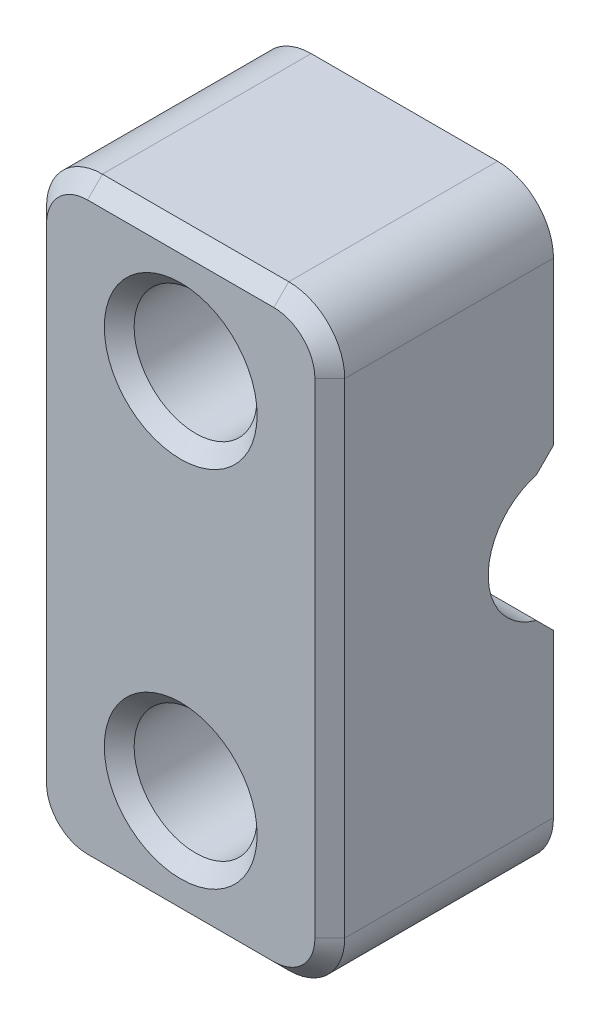
ISO-10303-21;
HEADER;
FILE_DESCRIPTION(('STEP AP214'),'2;1');
FILE_NAME('part.step','',(''),(''),'','','');
FILE_SCHEMA(('AUTOMOTIVE_DESIGN { 1 0 10303 214 1 1 1 1 }'));
ENDSEC;
DATA;
#1=APPLICATION_CONTEXT('core data for automotive mechanical design processes');
#2=APPLICATION_PROTOCOL_DEFINITION('international standard','automotive_design',2000,#1);
#3=PRODUCT_CONTEXT('',#1,'mechanical');
#4=PRODUCT('Part','Part','',(#3));
#5=PRODUCT_RELATED_PRODUCT_CATEGORY('part','',(#4));
#6=PRODUCT_DEFINITION_FORMATION('','',#4);
#7=PRODUCT_DEFINITION_CONTEXT('part definition',#1,'design');
#8=PRODUCT_DEFINITION('design','',#6,#7);
#9=PRODUCT_DEFINITION_SHAPE('','',#8);
#10=(LENGTH_UNIT() NAMED_UNIT(*) SI_UNIT(.MILLI.,.METRE.));
#11=(NAMED_UNIT(*) PLANE_ANGLE_UNIT() SI_UNIT($,.RADIAN.));
#12=(NAMED_UNIT(*) SI_UNIT($,.STERADIAN.) SOLID_ANGLE_UNIT());
#13=UNCERTAINTY_MEASURE_WITH_UNIT(LENGTH_MEASURE(1.E-05),#10,'distance_accuracy_value','');
#14=(GEOMETRIC_REPRESENTATION_CONTEXT(3) GLOBAL_UNCERTAINTY_ASSIGNED_CONTEXT((#13)) GLOBAL_UNIT_ASSIGNED_CONTEXT((#10,
#11,#12)) REPRESENTATION_CONTEXT('',''));
#15=CARTESIAN_POINT('',(0.,0.,0.));
#16=DIRECTION('',(0.,0.,1.));
#17=DIRECTION('',(1.,0.,0.));
#18=AXIS2_PLACEMENT_3D('',#15,#16,#17);
#19=CARTESIAN_POINT('',(0.,0.,0.));
#20=DIRECTION('',(0.,0.,1.));
#21=DIRECTION('',(1.,0.,0.));
#22=AXIS2_PLACEMENT_3D('',#19,#20,#21);
#23=PLANE('',#22);
#24=CARTESIAN_POINT('',(0.,4.875,0.));
#25=DIRECTION('',(0.,0.,-1.));
#26=DIRECTION('',(-1.,0.,0.));
#27=AXIS2_PLACEMENT_3D('',#24,#25,#26);
#28=CIRCLE('',#27,1.65);
#29=CARTESIAN_POINT('',(-1.65,4.875,0.));
#30=VERTEX_POINT('',#29);
#31=EDGE_CURVE('E278',#30,#30,#28,.T.);
#32=ORIENTED_EDGE('',*,*,#31,.F.);
#33=EDGE_LOOP('',(#32));
#34=FACE_BOUND('',#33,.T.);
#35=DIRECTION('',(0.,1.,0.));
#36=VECTOR('',#35,1.);
#37=CARTESIAN_POINT('',(4.,8.,0.));
#38=LINE('',#37,#36);
#39=CARTESIAN_POINT('',(4.,2.15,0.));
#40=VERTEX_POINT('',#39);
#41=CARTESIAN_POINT('',(4.,6.5,0.));
#42=VERTEX_POINT('',#41);
#43=EDGE_CURVE('E175',#40,#42,#38,.T.);
#44=ORIENTED_EDGE('',*,*,#43,.F.);
#45=DIRECTION('',(-1.,0.,0.));
#46=VECTOR('',#45,1.);
#47=CARTESIAN_POINT('',(0.,2.15,0.));
#48=LINE('',#47,#46);
#49=CARTESIAN_POINT('',(-4.,2.15,0.));
#50=VERTEX_POINT('',#49);
#51=EDGE_CURVE('E255',#40,#50,#48,.T.);
#52=ORIENTED_EDGE('',*,*,#51,.T.);
#53=DIRECTION('',(0.,-1.,0.));
#54=VECTOR('',#53,1.);
#55=CARTESIAN_POINT('',(-4.,8.,0.));
#56=LINE('',#55,#54);
#57=CARTESIAN_POINT('',(-4.,6.5,0.));
#58=VERTEX_POINT('',#57);
#59=EDGE_CURVE('E185',#58,#50,#56,.T.);
#60=ORIENTED_EDGE('',*,*,#59,.F.);
#61=CARTESIAN_POINT('',(-2.5,6.5,0.));
#62=DIRECTION('',(0.,0.,1.));
#63=DIRECTION('',(1.,0.,0.));
#64=AXIS2_PLACEMENT_3D('',#61,#62,#63);
#65=CIRCLE('',#64,1.5);
#66=CARTESIAN_POINT('',(-2.5,8.,0.));
#67=VERTEX_POINT('',#66);
#68=EDGE_CURVE('E203',#58,#67,#65,.F.);
#69=ORIENTED_EDGE('',*,*,#68,.T.);
#70=DIRECTION('',(-1.,0.,0.));
#71=VECTOR('',#70,1.);
#72=CARTESIAN_POINT('',(-4.,8.,0.));
#73=LINE('',#72,#71);
#74=CARTESIAN_POINT('',(2.5,8.,0.));
#75=VERTEX_POINT('',#74);
#76=EDGE_CURVE('E174',#75,#67,#73,.T.);
#77=ORIENTED_EDGE('',*,*,#76,.F.);
#78=CARTESIAN_POINT('',(2.5,6.5,0.));
#79=DIRECTION('',(0.,0.,1.));
#80=DIRECTION('',(1.,0.,0.));
#81=AXIS2_PLACEMENT_3D('',#78,#79,#80);
#82=CIRCLE('',#81,1.5);
#83=EDGE_CURVE('E200',#75,#42,#82,.F.);
#84=ORIENTED_EDGE('',*,*,#83,.T.);
#85=EDGE_LOOP('',(#44,#52,#60,#69,#77,#84));
#86=FACE_BOUND('',#85,.T.);
#87=ADVANCED_FACE('F34',(#34,#86),#23,.F.);
#88=CARTESIAN_POINT('',(4.,8.,6.));
#89=DIRECTION('',(-1.,0.,0.));
#90=DIRECTION('',(0.,-1.,0.));
#91=AXIS2_PLACEMENT_3D('',#88,#89,#90);
#92=PLANE('',#91);
#93=CARTESIAN_POINT('',(4.,0.,0.));
#94=DIRECTION('',(-1.,0.,0.));
#95=DIRECTION('',(0.,-1.,0.));
#96=AXIS2_PLACEMENT_3D('',#93,#94,#95);
#97=CIRCLE('',#96,1.75);
#98=CARTESIAN_POINT('',(4.,-1.68788253360656,0.462117466393437));
#99=VERTEX_POINT('',#98);
#100=CARTESIAN_POINT('',(4.,1.68788253360656,0.462117466393438));
#101=VERTEX_POINT('',#100);
#102=EDGE_CURVE('E180',#99,#101,#97,.T.);
#103=ORIENTED_EDGE('',*,*,#102,.T.);
#104=DIRECTION('',(0.,-0.707106781186546,0.707106781186549));
#105=VECTOR('',#104,1.);
#106=CARTESIAN_POINT('',(4.,2.15,0.));
#107=LINE('',#106,#105);
#108=EDGE_CURVE('E42',#101,#40,#107,.F.);
#109=ORIENTED_EDGE('',*,*,#108,.T.);
#110=ORIENTED_EDGE('',*,*,#43,.T.);
#111=DIRECTION('',(0.,0.,-1.));
#112=VECTOR('',#111,1.);
#113=CARTESIAN_POINT('',(4.,6.5,6.));
#114=LINE('',#113,#112);
#115=CARTESIAN_POINT('',(4.,6.5,5.6));
#116=VERTEX_POINT('',#115);
#117=EDGE_CURVE('E160',#42,#116,#114,.F.);
#118=ORIENTED_EDGE('',*,*,#117,.T.);
#119=DIRECTION('',(0.,-1.,0.));
#120=VECTOR('',#119,1.);
#121=CARTESIAN_POINT('',(4.,-6.5,5.6));
#122=LINE('',#121,#120);
#123=CARTESIAN_POINT('',(4.,-6.5,5.6));
#124=VERTEX_POINT('',#123);
#125=EDGE_CURVE('E156',#116,#124,#122,.T.);
#126=ORIENTED_EDGE('',*,*,#125,.T.);
#127=DIRECTION('',(0.,0.,-1.));
#128=VECTOR('',#127,1.);
#129=CARTESIAN_POINT('',(4.,-6.5,6.));
#130=LINE('',#129,#128);
#131=CARTESIAN_POINT('',(4.,-6.5,0.));
#132=VERTEX_POINT('',#131);
#133=EDGE_CURVE('E149',#124,#132,#130,.T.);
#134=ORIENTED_EDGE('',*,*,#133,.T.);
#135=CARTESIAN_POINT('',(4.,-2.15,0.));
#136=VERTEX_POINT('',#135);
#137=EDGE_CURVE('E153',#132,#136,#38,.T.);
#138=ORIENTED_EDGE('',*,*,#137,.T.);
#139=DIRECTION('',(0.,0.707106781186546,0.707106781186549));
#140=VECTOR('',#139,1.);
#141=CARTESIAN_POINT('',(4.,-2.15,0.));
#142=LINE('',#141,#140);
#143=EDGE_CURVE('E49',#136,#99,#142,.T.);
#144=ORIENTED_EDGE('',*,*,#143,.T.);
#145=EDGE_LOOP('',(#103,#109,#110,#118,#126,#134,#138,#144));
#146=FACE_BOUND('',#145,.T.);
#147=ADVANCED_FACE('F151',(#146),#92,.F.);
#148=CARTESIAN_POINT('',(-4.,8.,6.));
#149=DIRECTION('',(0.,-1.,0.));
#150=DIRECTION('',(0.,0.,-1.));
#151=AXIS2_PLACEMENT_3D('',#148,#149,#150);
#152=PLANE('',#151);
#153=DIRECTION('',(0.,0.,-1.));
#154=VECTOR('',#153,1.);
#155=CARTESIAN_POINT('',(-2.5,8.,6.));
#156=LINE('',#155,#154);
#157=CARTESIAN_POINT('',(-2.5,8.,5.6));
#158=VERTEX_POINT('',#157);
#159=EDGE_CURVE('E207',#67,#158,#156,.F.);
#160=ORIENTED_EDGE('',*,*,#159,.T.);
#161=DIRECTION('',(1.,0.,0.));
#162=VECTOR('',#161,1.);
#163=CARTESIAN_POINT('',(2.5,8.,5.6));
#164=LINE('',#163,#162);
#165=CARTESIAN_POINT('',(2.5,8.,5.6));
#166=VERTEX_POINT('',#165);
#167=EDGE_CURVE('E248',#158,#166,#164,.T.);
#168=ORIENTED_EDGE('',*,*,#167,.T.);
#169=DIRECTION('',(0.,0.,-1.));
#170=VECTOR('',#169,1.);
#171=CARTESIAN_POINT('',(2.5,8.,6.));
#172=LINE('',#171,#170);
#173=EDGE_CURVE('E205',#166,#75,#172,.T.);
#174=ORIENTED_EDGE('',*,*,#173,.T.);
#175=ORIENTED_EDGE('',*,*,#76,.T.);
#176=EDGE_LOOP('',(#160,#168,#174,#175));
#177=FACE_BOUND('',#176,.T.);
#178=ADVANCED_FACE('F319',(#177),#152,.F.);
#179=CARTESIAN_POINT('',(-4.,8.,6.));
#180=DIRECTION('',(1.,0.,0.));
#181=DIRECTION('',(0.,1.,0.));
#182=AXIS2_PLACEMENT_3D('',#179,#180,#181);
#183=PLANE('',#182);
#184=ORIENTED_EDGE('',*,*,#59,.T.);
#185=DIRECTION('',(0.,0.707106781186546,-0.707106781186549));
#186=VECTOR('',#185,1.);
#187=CARTESIAN_POINT('',(-4.,2.15,0.));
#188=LINE('',#187,#186);
#189=CARTESIAN_POINT('',(-4.,1.68788253360656,0.462117466393438));
#190=VERTEX_POINT('',#189);
#191=EDGE_CURVE('E283',#50,#190,#188,.F.);
#192=ORIENTED_EDGE('',*,*,#191,.T.);
#193=CARTESIAN_POINT('',(-4.,0.,0.));
#194=DIRECTION('',(-1.,0.,0.));
#195=DIRECTION('',(0.,-1.,0.));
#196=AXIS2_PLACEMENT_3D('',#193,#194,#195);
#197=CIRCLE('',#196,1.75);
#198=CARTESIAN_POINT('',(-4.,-1.68788253360656,0.462117466393437));
#199=VERTEX_POINT('',#198);
#200=EDGE_CURVE('E182',#199,#190,#197,.T.);
#201=ORIENTED_EDGE('',*,*,#200,.F.);
#202=DIRECTION('',(0.,-0.707106781186546,-0.707106781186549));
#203=VECTOR('',#202,1.);
#204=CARTESIAN_POINT('',(-4.,-2.15,0.));
#205=LINE('',#204,#203);
#206=CARTESIAN_POINT('',(-4.,-2.15,0.));
#207=VERTEX_POINT('',#206);
#208=EDGE_CURVE('E281',#199,#207,#205,.T.);
#209=ORIENTED_EDGE('',*,*,#208,.T.);
#210=CARTESIAN_POINT('',(-4.,-6.5,0.));
#211=VERTEX_POINT('',#210);
#212=EDGE_CURVE('E178',#207,#211,#56,.T.);
#213=ORIENTED_EDGE('',*,*,#212,.T.);
#214=DIRECTION('',(0.,0.,-1.));
#215=VECTOR('',#214,1.);
#216=CARTESIAN_POINT('',(-4.,-6.5,6.));
#217=LINE('',#216,#215);
#218=CARTESIAN_POINT('',(-4.,-6.5,5.6));
#219=VERTEX_POINT('',#218);
#220=EDGE_CURVE('E197',#211,#219,#217,.F.);
#221=ORIENTED_EDGE('',*,*,#220,.T.);
#222=DIRECTION('',(0.,1.,0.));
#223=VECTOR('',#222,1.);
#224=CARTESIAN_POINT('',(-4.,6.5,5.6));
#225=LINE('',#224,#223);
#226=CARTESIAN_POINT('',(-4.,6.5,5.6));
#227=VERTEX_POINT('',#226);
#228=EDGE_CURVE('E239',#219,#227,#225,.T.);
#229=ORIENTED_EDGE('',*,*,#228,.T.);
#230=DIRECTION('',(0.,0.,-1.));
#231=VECTOR('',#230,1.);
#232=CARTESIAN_POINT('',(-4.,6.5,6.));
#233=LINE('',#232,#231);
#234=EDGE_CURVE('E195',#227,#58,#233,.T.);
#235=ORIENTED_EDGE('',*,*,#234,.T.);
#236=EDGE_LOOP('',(#184,#192,#201,#209,#213,#221,#229,#235));
#237=FACE_BOUND('',#236,.T.);
#238=ADVANCED_FACE('F300',(#237),#183,.F.);
#239=CARTESIAN_POINT('',(-4.,-8.,6.));
#240=DIRECTION('',(0.,1.,0.));
#241=DIRECTION('',(0.,0.,1.));
#242=AXIS2_PLACEMENT_3D('',#239,#240,#241);
#243=PLANE('',#242);
#244=DIRECTION('',(0.,0.,-1.));
#245=VECTOR('',#244,1.);
#246=CARTESIAN_POINT('',(2.5,-8.,6.));
#247=LINE('',#246,#245);
#248=CARTESIAN_POINT('',(2.5,-8.,0.));
#249=VERTEX_POINT('',#248);
#250=CARTESIAN_POINT('',(2.5,-8.,5.6));
#251=VERTEX_POINT('',#250);
#252=EDGE_CURVE('E166',#249,#251,#247,.F.);
#253=ORIENTED_EDGE('',*,*,#252,.T.);
#254=DIRECTION('',(-1.,0.,0.));
#255=VECTOR('',#254,1.);
#256=CARTESIAN_POINT('',(-2.5,-8.,5.6));
#257=LINE('',#256,#255);
#258=CARTESIAN_POINT('',(-2.5,-8.,5.6));
#259=VERTEX_POINT('',#258);
#260=EDGE_CURVE('E246',#251,#259,#257,.T.);
#261=ORIENTED_EDGE('',*,*,#260,.T.);
#262=DIRECTION('',(0.,0.,-1.));
#263=VECTOR('',#262,1.);
#264=CARTESIAN_POINT('',(-2.5,-8.,6.));
#265=LINE('',#264,#263);
#266=CARTESIAN_POINT('',(-2.5,-8.,0.));
#267=VERTEX_POINT('',#266);
#268=EDGE_CURVE('E170',#259,#267,#265,.T.);
#269=ORIENTED_EDGE('',*,*,#268,.T.);
#270=DIRECTION('',(1.,0.,0.));
#271=VECTOR('',#270,1.);
#272=CARTESIAN_POINT('',(-4.,-8.,0.));
#273=LINE('',#272,#271);
#274=EDGE_CURVE('E188',#267,#249,#273,.T.);
#275=ORIENTED_EDGE('',*,*,#274,.T.);
#276=EDGE_LOOP('',(#253,#261,#269,#275));
#277=FACE_BOUND('',#276,.T.);
#278=ADVANCED_FACE('F332',(#277),#243,.F.);
#279=CARTESIAN_POINT('',(0.,0.,6.));
#280=DIRECTION('',(0.,0.,1.));
#281=DIRECTION('',(1.,0.,0.));
#282=AXIS2_PLACEMENT_3D('',#279,#280,#281);
#283=PLANE('',#282);
#284=CARTESIAN_POINT('',(0.,4.875,6.));
#285=DIRECTION('',(0.,0.,1.));
#286=DIRECTION('',(1.,0.,0.));
#287=AXIS2_PLACEMENT_3D('',#284,#285,#286);
#288=CIRCLE('',#287,2.05);
#289=CARTESIAN_POINT('',(2.05,4.875,6.));
#290=VERTEX_POINT('',#289);
#291=EDGE_CURVE('E230',#290,#290,#288,.F.);
#292=ORIENTED_EDGE('',*,*,#291,.T.);
#293=EDGE_LOOP('',(#292));
#294=FACE_BOUND('',#293,.T.);
#295=CARTESIAN_POINT('',(0.,-4.875,6.));
#296=DIRECTION('',(0.,0.,1.));
#297=DIRECTION('',(1.,0.,0.));
#298=AXIS2_PLACEMENT_3D('',#295,#296,#297);
#299=CIRCLE('',#298,2.05);
#300=CARTESIAN_POINT('',(2.05,-4.875,6.));
#301=VERTEX_POINT('',#300);
#302=EDGE_CURVE('E227',#301,#301,#299,.F.);
#303=ORIENTED_EDGE('',*,*,#302,.T.);
#304=EDGE_LOOP('',(#303));
#305=FACE_BOUND('',#304,.T.);
#306=CARTESIAN_POINT('',(-2.5,6.5,6.));
#307=DIRECTION('',(0.,0.,1.));
#308=DIRECTION('',(1.,0.,0.));
#309=AXIS2_PLACEMENT_3D('',#306,#307,#308);
#310=CIRCLE('',#309,1.1);
#311=CARTESIAN_POINT('',(-2.5,7.6,6.));
#312=VERTEX_POINT('',#311);
#313=CARTESIAN_POINT('',(-3.6,6.5,6.));
#314=VERTEX_POINT('',#313);
#315=EDGE_CURVE('E220',#312,#314,#310,.T.);
#316=ORIENTED_EDGE('',*,*,#315,.T.);
#317=DIRECTION('',(0.,-1.,0.));
#318=VECTOR('',#317,1.);
#319=CARTESIAN_POINT('',(-3.6,-6.5,6.));
#320=LINE('',#319,#318);
#321=CARTESIAN_POINT('',(-3.6,-6.5,6.));
#322=VERTEX_POINT('',#321);
#323=EDGE_CURVE('E224',#314,#322,#320,.T.);
#324=ORIENTED_EDGE('',*,*,#323,.T.);
#325=CARTESIAN_POINT('',(-2.5,-6.5,6.));
#326=DIRECTION('',(0.,0.,1.));
#327=DIRECTION('',(1.,0.,0.));
#328=AXIS2_PLACEMENT_3D('',#325,#326,#327);
#329=CIRCLE('',#328,1.1);
#330=CARTESIAN_POINT('',(-2.5,-7.6,6.));
#331=VERTEX_POINT('',#330);
#332=EDGE_CURVE('E222',#322,#331,#329,.T.);
#333=ORIENTED_EDGE('',*,*,#332,.T.);
#334=DIRECTION('',(1.,0.,0.));
#335=VECTOR('',#334,1.);
#336=CARTESIAN_POINT('',(2.5,-7.6,6.));
#337=LINE('',#336,#335);
#338=CARTESIAN_POINT('',(2.5,-7.6,6.));
#339=VERTEX_POINT('',#338);
#340=EDGE_CURVE('E218',#331,#339,#337,.T.);
#341=ORIENTED_EDGE('',*,*,#340,.T.);
#342=CARTESIAN_POINT('',(2.5,-6.5,6.));
#343=DIRECTION('',(0.,0.,1.));
#344=DIRECTION('',(1.,0.,0.));
#345=AXIS2_PLACEMENT_3D('',#342,#343,#344);
#346=CIRCLE('',#345,1.1);
#347=CARTESIAN_POINT('',(3.6,-6.5,6.));
#348=VERTEX_POINT('',#347);
#349=EDGE_CURVE('E214',#339,#348,#346,.T.);
#350=ORIENTED_EDGE('',*,*,#349,.T.);
#351=DIRECTION('',(0.,1.,0.));
#352=VECTOR('',#351,1.);
#353=CARTESIAN_POINT('',(3.6,6.5,6.));
#354=LINE('',#353,#352);
#355=CARTESIAN_POINT('',(3.6,6.5,6.));
#356=VERTEX_POINT('',#355);
#357=EDGE_CURVE('E210',#348,#356,#354,.T.);
#358=ORIENTED_EDGE('',*,*,#357,.T.);
#359=CARTESIAN_POINT('',(2.5,6.5,6.));
#360=DIRECTION('',(0.,0.,1.));
#361=DIRECTION('',(1.,0.,0.));
#362=AXIS2_PLACEMENT_3D('',#359,#360,#361);
#363=CIRCLE('',#362,1.1);
#364=CARTESIAN_POINT('',(2.5,7.6,6.));
#365=VERTEX_POINT('',#364);
#366=EDGE_CURVE('E212',#356,#365,#363,.T.);
#367=ORIENTED_EDGE('',*,*,#366,.T.);
#368=DIRECTION('',(-1.,0.,0.));
#369=VECTOR('',#368,1.);
#370=CARTESIAN_POINT('',(-2.5,7.6,6.));
#371=LINE('',#370,#369);
#372=EDGE_CURVE('E216',#365,#312,#371,.T.);
#373=ORIENTED_EDGE('',*,*,#372,.T.);
#374=EDGE_LOOP('',(#316,#324,#333,#341,#350,#358,#367,#373));
#375=FACE_BOUND('',#374,.T.);
#376=ADVANCED_FACE('F324',(#294,#305,#375),#283,.T.);
#377=CARTESIAN_POINT('',(0.,-4.875,0.));
#378=DIRECTION('',(0.,0.,-1.));
#379=DIRECTION('',(-1.,0.,0.));
#380=AXIS2_PLACEMENT_3D('',#377,#378,#379);
#381=CIRCLE('',#380,1.65);
#382=CARTESIAN_POINT('',(-1.65,-4.875,0.));
#383=VERTEX_POINT('',#382);
#384=EDGE_CURVE('E303',#383,#383,#381,.T.);
#385=ORIENTED_EDGE('',*,*,#384,.F.);
#386=EDGE_LOOP('',(#385));
#387=FACE_BOUND('',#386,.T.);
#388=ORIENTED_EDGE('',*,*,#212,.F.);
#389=DIRECTION('',(1.,0.,0.));
#390=VECTOR('',#389,1.);
#391=CARTESIAN_POINT('',(0.,-2.15,0.));
#392=LINE('',#391,#390);
#393=EDGE_CURVE('E11',#207,#136,#392,.T.);
#394=ORIENTED_EDGE('',*,*,#393,.T.);
#395=ORIENTED_EDGE('',*,*,#137,.F.);
#396=CARTESIAN_POINT('',(2.5,-6.5,0.));
#397=DIRECTION('',(0.,0.,1.));
#398=DIRECTION('',(1.,0.,0.));
#399=AXIS2_PLACEMENT_3D('',#396,#397,#398);
#400=CIRCLE('',#399,1.5);
#401=EDGE_CURVE('E163',#132,#249,#400,.F.);
#402=ORIENTED_EDGE('',*,*,#401,.T.);
#403=ORIENTED_EDGE('',*,*,#274,.F.);
#404=CARTESIAN_POINT('',(-2.5,-6.5,0.));
#405=DIRECTION('',(0.,0.,1.));
#406=DIRECTION('',(1.,0.,0.));
#407=AXIS2_PLACEMENT_3D('',#404,#405,#406);
#408=CIRCLE('',#407,1.5);
#409=EDGE_CURVE('E159',#267,#211,#408,.F.);
#410=ORIENTED_EDGE('',*,*,#409,.T.);
#411=EDGE_LOOP('',(#388,#394,#395,#402,#403,#410));
#412=FACE_BOUND('',#411,.T.);
#413=ADVANCED_FACE('F173',(#387,#412),#23,.F.);
#414=CARTESIAN_POINT('',(4.,0.,0.));
#415=DIRECTION('',(-1.,0.,0.));
#416=DIRECTION('',(0.,-1.,0.));
#417=AXIS2_PLACEMENT_3D('',#414,#415,#416);
#418=CYLINDRICAL_SURFACE('',#417,1.75);
#419=ORIENTED_EDGE('',*,*,#200,.T.);
#420=DIRECTION('',(-1.,0.,0.));
#421=VECTOR('',#420,1.);
#422=CARTESIAN_POINT('',(4.,1.68788253360656,0.462117466393438));
#423=LINE('',#422,#421);
#424=EDGE_CURVE('E56',#190,#101,#423,.F.);
#425=ORIENTED_EDGE('',*,*,#424,.T.);
#426=ORIENTED_EDGE('',*,*,#102,.F.);
#427=DIRECTION('',(-1.,0.,0.));
#428=VECTOR('',#427,1.);
#429=CARTESIAN_POINT('',(4.,-1.68788253360656,0.462117466393437));
#430=LINE('',#429,#428);
#431=EDGE_CURVE('E285',#99,#199,#430,.T.);
#432=ORIENTED_EDGE('',*,*,#431,.T.);
#433=EDGE_LOOP('',(#419,#425,#426,#432));
#434=FACE_BOUND('',#433,.T.);
#435=ADVANCED_FACE('F302',(#434),#418,.F.);
#436=CARTESIAN_POINT('',(0.,-4.875,6.));
#437=DIRECTION('',(0.,0.,-1.));
#438=DIRECTION('',(-1.,0.,0.));
#439=AXIS2_PLACEMENT_3D('',#436,#437,#438);
#440=CYLINDRICAL_SURFACE('',#439,1.65);
#441=CARTESIAN_POINT('',(0.,-4.875,5.6));
#442=DIRECTION('',(0.,0.,1.));
#443=DIRECTION('',(1.,0.,0.));
#444=AXIS2_PLACEMENT_3D('',#441,#442,#443);
#445=CIRCLE('',#444,1.65);
#446=CARTESIAN_POINT('',(1.65,-4.875,5.6));
#447=VERTEX_POINT('',#446);
#448=EDGE_CURVE('E236',#447,#447,#445,.T.);
#449=ORIENTED_EDGE('',*,*,#448,.T.);
#450=EDGE_LOOP('',(#449));
#451=FACE_BOUND('',#450,.T.);
#452=ORIENTED_EDGE('',*,*,#384,.T.);
#453=EDGE_LOOP('',(#452));
#454=FACE_BOUND('',#453,.T.);
#455=ADVANCED_FACE('F330',(#451,#454),#440,.F.);
#456=CARTESIAN_POINT('',(0.,4.875,6.));
#457=DIRECTION('',(0.,0.,-1.));
#458=DIRECTION('',(-1.,0.,0.));
#459=AXIS2_PLACEMENT_3D('',#456,#457,#458);
#460=CYLINDRICAL_SURFACE('',#459,1.65);
#461=CARTESIAN_POINT('',(0.,4.875,5.6));
#462=DIRECTION('',(0.,0.,1.));
#463=DIRECTION('',(1.,0.,0.));
#464=AXIS2_PLACEMENT_3D('',#461,#462,#463);
#465=CIRCLE('',#464,1.65);
#466=CARTESIAN_POINT('',(1.65,4.875,5.6));
#467=VERTEX_POINT('',#466);
#468=EDGE_CURVE('E233',#467,#467,#465,.T.);
#469=ORIENTED_EDGE('',*,*,#468,.T.);
#470=EDGE_LOOP('',(#469));
#471=FACE_BOUND('',#470,.T.);
#472=ORIENTED_EDGE('',*,*,#31,.T.);
#473=EDGE_LOOP('',(#472));
#474=FACE_BOUND('',#473,.T.);
#475=ADVANCED_FACE('F312',(#471,#474),#460,.F.);
#476=CARTESIAN_POINT('',(2.5,-6.5,6.));
#477=DIRECTION('',(0.,0.,-1.));
#478=DIRECTION('',(-1.,0.,0.));
#479=AXIS2_PLACEMENT_3D('',#476,#477,#478);
#480=CYLINDRICAL_SURFACE('',#479,1.5);
#481=ORIENTED_EDGE('',*,*,#133,.F.);
#482=CARTESIAN_POINT('',(2.5,-6.5,5.6));
#483=DIRECTION('',(0.,0.,1.));
#484=DIRECTION('',(1.,0.,0.));
#485=AXIS2_PLACEMENT_3D('',#482,#483,#484);
#486=CIRCLE('',#485,1.5);
#487=EDGE_CURVE('E250',#124,#251,#486,.F.);
#488=ORIENTED_EDGE('',*,*,#487,.T.);
#489=ORIENTED_EDGE('',*,*,#252,.F.);
#490=ORIENTED_EDGE('',*,*,#401,.F.);
#491=EDGE_LOOP('',(#481,#488,#489,#490));
#492=FACE_BOUND('',#491,.T.);
#493=ADVANCED_FACE('F164',(#492),#480,.T.);
#494=CARTESIAN_POINT('',(-2.5,-6.5,6.));
#495=DIRECTION('',(0.,0.,-1.));
#496=DIRECTION('',(-1.,0.,0.));
#497=AXIS2_PLACEMENT_3D('',#494,#495,#496);
#498=CYLINDRICAL_SURFACE('',#497,1.5);
#499=ORIENTED_EDGE('',*,*,#268,.F.);
#500=CARTESIAN_POINT('',(-2.5,-6.5,5.6));
#501=DIRECTION('',(0.,0.,1.));
#502=DIRECTION('',(1.,0.,0.));
#503=AXIS2_PLACEMENT_3D('',#500,#501,#502);
#504=CIRCLE('',#503,1.5);
#505=EDGE_CURVE('E242',#259,#219,#504,.F.);
#506=ORIENTED_EDGE('',*,*,#505,.T.);
#507=ORIENTED_EDGE('',*,*,#220,.F.);
#508=ORIENTED_EDGE('',*,*,#409,.F.);
#509=EDGE_LOOP('',(#499,#506,#507,#508));
#510=FACE_BOUND('',#509,.T.);
#511=ADVANCED_FACE('F407',(#510),#498,.T.);
#512=CARTESIAN_POINT('',(-2.5,6.5,6.));
#513=DIRECTION('',(0.,0.,-1.));
#514=DIRECTION('',(-1.,0.,0.));
#515=AXIS2_PLACEMENT_3D('',#512,#513,#514);
#516=CYLINDRICAL_SURFACE('',#515,1.5);
#517=ORIENTED_EDGE('',*,*,#234,.F.);
#518=CARTESIAN_POINT('',(-2.5,6.5,5.6));
#519=DIRECTION('',(0.,0.,1.));
#520=DIRECTION('',(1.,0.,0.));
#521=AXIS2_PLACEMENT_3D('',#518,#519,#520);
#522=CIRCLE('',#521,1.5);
#523=EDGE_CURVE('E244',#227,#158,#522,.F.);
#524=ORIENTED_EDGE('',*,*,#523,.T.);
#525=ORIENTED_EDGE('',*,*,#159,.F.);
#526=ORIENTED_EDGE('',*,*,#68,.F.);
#527=EDGE_LOOP('',(#517,#524,#525,#526));
#528=FACE_BOUND('',#527,.T.);
#529=ADVANCED_FACE('F402',(#528),#516,.T.);
#530=CARTESIAN_POINT('',(2.5,6.5,6.));
#531=DIRECTION('',(0.,0.,-1.));
#532=DIRECTION('',(-1.,0.,0.));
#533=AXIS2_PLACEMENT_3D('',#530,#531,#532);
#534=CYLINDRICAL_SURFACE('',#533,1.5);
#535=ORIENTED_EDGE('',*,*,#173,.F.);
#536=CARTESIAN_POINT('',(2.5,6.5,5.6));
#537=DIRECTION('',(0.,0.,1.));
#538=DIRECTION('',(1.,0.,0.));
#539=AXIS2_PLACEMENT_3D('',#536,#537,#538);
#540=CIRCLE('',#539,1.5);
#541=EDGE_CURVE('E252',#166,#116,#540,.F.);
#542=ORIENTED_EDGE('',*,*,#541,.T.);
#543=ORIENTED_EDGE('',*,*,#117,.F.);
#544=ORIENTED_EDGE('',*,*,#83,.F.);
#545=EDGE_LOOP('',(#535,#542,#543,#544));
#546=FACE_BOUND('',#545,.T.);
#547=ADVANCED_FACE('F398',(#546),#534,.T.);
#548=CARTESIAN_POINT('',(0.,4.875,6.));
#549=DIRECTION('',(0.,0.,1.));
#550=DIRECTION('',(1.,0.,0.));
#551=AXIS2_PLACEMENT_3D('',#548,#549,#550);
#552=CONICAL_SURFACE('',#551,2.05,0.785398163397446);
#553=ORIENTED_EDGE('',*,*,#468,.F.);
#554=EDGE_LOOP('',(#553));
#555=FACE_BOUND('',#554,.T.);
#556=ORIENTED_EDGE('',*,*,#291,.F.);
#557=EDGE_LOOP('',(#556));
#558=FACE_BOUND('',#557,.T.);
#559=ADVANCED_FACE('F353',(#555,#558),#552,.F.);
#560=CARTESIAN_POINT('',(0.,-4.875,6.));
#561=DIRECTION('',(0.,0.,1.));
#562=DIRECTION('',(1.,0.,0.));
#563=AXIS2_PLACEMENT_3D('',#560,#561,#562);
#564=CONICAL_SURFACE('',#563,2.05,0.785398163397446);
#565=ORIENTED_EDGE('',*,*,#448,.F.);
#566=EDGE_LOOP('',(#565));
#567=FACE_BOUND('',#566,.T.);
#568=ORIENTED_EDGE('',*,*,#302,.F.);
#569=EDGE_LOOP('',(#568));
#570=FACE_BOUND('',#569,.T.);
#571=ADVANCED_FACE('F349',(#567,#570),#564,.F.);
#572=CARTESIAN_POINT('',(3.6,0.,6.));
#573=DIRECTION('',(0.707106781186549,0.,0.707106781186546));
#574=DIRECTION('',(0.,-1.,0.));
#575=AXIS2_PLACEMENT_3D('',#572,#573,#574);
#576=PLANE('',#575);
#577=DIRECTION('',(-0.707106781186546,0.,0.707106781186549));
#578=VECTOR('',#577,1.);
#579=CARTESIAN_POINT('',(4.,-6.5,5.6));
#580=LINE('',#579,#578);
#581=EDGE_CURVE('E272',#124,#348,#580,.T.);
#582=ORIENTED_EDGE('',*,*,#581,.F.);
#583=ORIENTED_EDGE('',*,*,#125,.F.);
#584=DIRECTION('',(0.707106781186546,0.,-0.707106781186549));
#585=VECTOR('',#584,1.);
#586=CARTESIAN_POINT('',(3.6,6.5,6.));
#587=LINE('',#586,#585);
#588=EDGE_CURVE('E275',#356,#116,#587,.T.);
#589=ORIENTED_EDGE('',*,*,#588,.F.);
#590=ORIENTED_EDGE('',*,*,#357,.F.);
#591=EDGE_LOOP('',(#582,#583,#589,#590));
#592=FACE_BOUND('',#591,.T.);
#593=ADVANCED_FACE('F352',(#592),#576,.T.);
#594=CARTESIAN_POINT('',(2.5,6.5,6.));
#595=DIRECTION('',(0.,0.,-1.));
#596=DIRECTION('',(-1.,0.,0.));
#597=AXIS2_PLACEMENT_3D('',#594,#595,#596);
#598=CONICAL_SURFACE('',#597,1.1,0.785398163397446);
#599=ORIENTED_EDGE('',*,*,#588,.T.);
#600=ORIENTED_EDGE('',*,*,#541,.F.);
#601=DIRECTION('',(0.,0.707106781186545,-0.70710678118655));
#602=VECTOR('',#601,1.);
#603=CARTESIAN_POINT('',(2.5,7.6,6.));
#604=LINE('',#603,#602);
#605=EDGE_CURVE('E269',#365,#166,#604,.T.);
#606=ORIENTED_EDGE('',*,*,#605,.F.);
#607=ORIENTED_EDGE('',*,*,#366,.F.);
#608=EDGE_LOOP('',(#599,#600,#606,#607));
#609=FACE_BOUND('',#608,.T.);
#610=ADVANCED_FACE('F390',(#609),#598,.T.);
#611=CARTESIAN_POINT('',(2.5,-6.5,6.));
#612=DIRECTION('',(0.,0.,-1.));
#613=DIRECTION('',(-1.,0.,0.));
#614=AXIS2_PLACEMENT_3D('',#611,#612,#613);
#615=CONICAL_SURFACE('',#614,1.1,0.785398163397447);
#616=ORIENTED_EDGE('',*,*,#581,.T.);
#617=ORIENTED_EDGE('',*,*,#349,.F.);
#618=DIRECTION('',(0.,0.707106781186546,0.707106781186549));
#619=VECTOR('',#618,1.);
#620=CARTESIAN_POINT('',(2.5,-8.,5.6));
#621=LINE('',#620,#619);
#622=EDGE_CURVE('E266',#251,#339,#621,.T.);
#623=ORIENTED_EDGE('',*,*,#622,.F.);
#624=ORIENTED_EDGE('',*,*,#487,.F.);
#625=EDGE_LOOP('',(#616,#617,#623,#624));
#626=FACE_BOUND('',#625,.T.);
#627=ADVANCED_FACE('F382',(#626),#615,.T.);
#628=CARTESIAN_POINT('',(0.,7.6,6.));
#629=DIRECTION('',(0.,0.707106781186549,0.707106781186546));
#630=DIRECTION('',(1.,0.,0.));
#631=AXIS2_PLACEMENT_3D('',#628,#629,#630);
#632=PLANE('',#631);
#633=ORIENTED_EDGE('',*,*,#605,.T.);
#634=ORIENTED_EDGE('',*,*,#167,.F.);
#635=DIRECTION('',(0.,0.707106781186546,-0.707106781186549));
#636=VECTOR('',#635,1.);
#637=CARTESIAN_POINT('',(-2.5,7.6,6.));
#638=LINE('',#637,#636);
#639=EDGE_CURVE('E263',#312,#158,#638,.T.);
#640=ORIENTED_EDGE('',*,*,#639,.F.);
#641=ORIENTED_EDGE('',*,*,#372,.F.);
#642=EDGE_LOOP('',(#633,#634,#640,#641));
#643=FACE_BOUND('',#642,.T.);
#644=ADVANCED_FACE('F393',(#643),#632,.T.);
#645=CARTESIAN_POINT('',(0.,-7.6,6.));
#646=DIRECTION('',(0.,-0.707106781186549,0.707106781186546));
#647=DIRECTION('',(-1.,0.,0.));
#648=AXIS2_PLACEMENT_3D('',#645,#646,#647);
#649=PLANE('',#648);
#650=ORIENTED_EDGE('',*,*,#622,.T.);
#651=ORIENTED_EDGE('',*,*,#340,.F.);
#652=DIRECTION('',(0.,0.707106781186546,0.707106781186549));
#653=VECTOR('',#652,1.);
#654=CARTESIAN_POINT('',(-2.5,-8.,5.6));
#655=LINE('',#654,#653);
#656=EDGE_CURVE('E260',#259,#331,#655,.T.);
#657=ORIENTED_EDGE('',*,*,#656,.F.);
#658=ORIENTED_EDGE('',*,*,#260,.F.);
#659=EDGE_LOOP('',(#650,#651,#657,#658));
#660=FACE_BOUND('',#659,.T.);
#661=ADVANCED_FACE('F377',(#660),#649,.T.);
#662=CARTESIAN_POINT('',(-2.5,6.5,6.));
#663=DIRECTION('',(0.,0.,-1.));
#664=DIRECTION('',(-1.,0.,0.));
#665=AXIS2_PLACEMENT_3D('',#662,#663,#664);
#666=CONICAL_SURFACE('',#665,1.1,0.785398163397447);
#667=ORIENTED_EDGE('',*,*,#639,.T.);
#668=ORIENTED_EDGE('',*,*,#523,.F.);
#669=DIRECTION('',(-0.707106781186546,0.,-0.707106781186549));
#670=VECTOR('',#669,1.);
#671=CARTESIAN_POINT('',(-3.6,6.5,6.));
#672=LINE('',#671,#670);
#673=EDGE_CURVE('E258',#314,#227,#672,.T.);
#674=ORIENTED_EDGE('',*,*,#673,.F.);
#675=ORIENTED_EDGE('',*,*,#315,.F.);
#676=EDGE_LOOP('',(#667,#668,#674,#675));
#677=FACE_BOUND('',#676,.T.);
#678=ADVANCED_FACE('F364',(#677),#666,.T.);
#679=CARTESIAN_POINT('',(-2.5,-6.5,6.));
#680=DIRECTION('',(0.,0.,-1.));
#681=DIRECTION('',(-1.,0.,0.));
#682=AXIS2_PLACEMENT_3D('',#679,#680,#681);
#683=CONICAL_SURFACE('',#682,1.1,0.785398163397446);
#684=ORIENTED_EDGE('',*,*,#656,.T.);
#685=ORIENTED_EDGE('',*,*,#332,.F.);
#686=DIRECTION('',(0.707106781186545,0.,0.70710678118655));
#687=VECTOR('',#686,1.);
#688=CARTESIAN_POINT('',(-4.,-6.5,5.6));
#689=LINE('',#688,#687);
#690=EDGE_CURVE('E256',#219,#322,#689,.T.);
#691=ORIENTED_EDGE('',*,*,#690,.F.);
#692=ORIENTED_EDGE('',*,*,#505,.F.);
#693=EDGE_LOOP('',(#684,#685,#691,#692));
#694=FACE_BOUND('',#693,.T.);
#695=ADVANCED_FACE('F372',(#694),#683,.T.);
#696=CARTESIAN_POINT('',(-3.6,0.,6.));
#697=DIRECTION('',(-0.707106781186549,0.,0.707106781186546));
#698=DIRECTION('',(0.,1.,0.));
#699=AXIS2_PLACEMENT_3D('',#696,#697,#698);
#700=PLANE('',#699);
#701=ORIENTED_EDGE('',*,*,#673,.T.);
#702=ORIENTED_EDGE('',*,*,#228,.F.);
#703=ORIENTED_EDGE('',*,*,#690,.T.);
#704=ORIENTED_EDGE('',*,*,#323,.F.);
#705=EDGE_LOOP('',(#701,#702,#703,#704));
#706=FACE_BOUND('',#705,.T.);
#707=ADVANCED_FACE('F367',(#706),#700,.T.);
#708=CARTESIAN_POINT('',(4.,2.15,0.));
#709=DIRECTION('',(0.,0.707106781186549,0.707106781186546));
#710=DIRECTION('',(-1.,0.,0.));
#711=AXIS2_PLACEMENT_3D('',#708,#709,#710);
#712=PLANE('',#711);
#713=ORIENTED_EDGE('',*,*,#108,.F.);
#714=ORIENTED_EDGE('',*,*,#424,.F.);
#715=ORIENTED_EDGE('',*,*,#191,.F.);
#716=ORIENTED_EDGE('',*,*,#51,.F.);
#717=EDGE_LOOP('',(#713,#714,#715,#716));
#718=FACE_BOUND('',#717,.T.);
#719=ADVANCED_FACE('F297',(#718),#712,.F.);
#720=CARTESIAN_POINT('',(4.,-2.15,0.));
#721=DIRECTION('',(0.,0.707106781186549,-0.707106781186546));
#722=DIRECTION('',(-1.,0.,0.));
#723=AXIS2_PLACEMENT_3D('',#720,#721,#722);
#724=PLANE('',#723);
#725=ORIENTED_EDGE('',*,*,#208,.F.);
#726=ORIENTED_EDGE('',*,*,#431,.F.);
#727=ORIENTED_EDGE('',*,*,#143,.F.);
#728=ORIENTED_EDGE('',*,*,#393,.F.);
#729=EDGE_LOOP('',(#725,#726,#727,#728));
#730=FACE_BOUND('',#729,.T.);
#731=ADVANCED_FACE('F36',(#730),#724,.T.);
#732=CLOSED_SHELL('',(#87,#147,#178,#238,#278,#376,#413,#435,#455,#475,#493,#511,#529,#547,#559,
#571,#593,#610,#627,#644,#661,#678,#695,#707,#719,#731));
#733=MANIFOLD_SOLID_BREP('B2',#732);
#734=ADVANCED_BREP_SHAPE_REPRESENTATION('',(#18,#733),#14);
#735=SHAPE_DEFINITION_REPRESENTATION(#9,#734);
ENDSEC;
END-ISO-10303-21;
